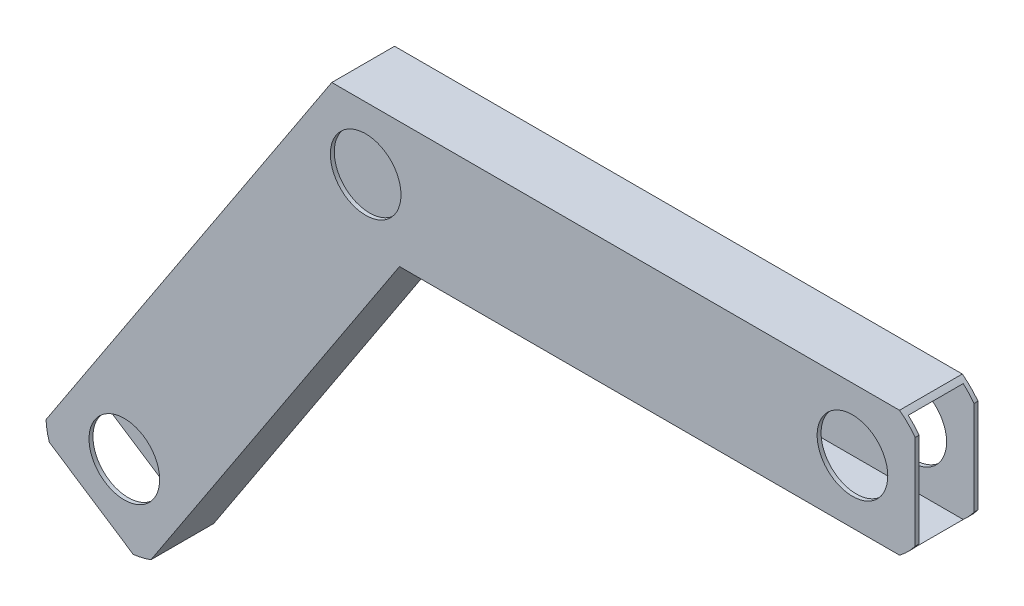
ISO-10303-21;
HEADER;
FILE_DESCRIPTION(('STEP AP214'),'2;1');
FILE_NAME('part.step','',(''),(''),'','','');
FILE_SCHEMA(('AUTOMOTIVE_DESIGN { 1 0 10303 214 1 1 1 1 }'));
ENDSEC;
DATA;
#1=APPLICATION_CONTEXT('core data for automotive mechanical design processes');
#2=APPLICATION_PROTOCOL_DEFINITION('international standard','automotive_design',2000,#1);
#3=PRODUCT_CONTEXT('',#1,'mechanical');
#4=PRODUCT('Part','Part','',(#3));
#5=PRODUCT_RELATED_PRODUCT_CATEGORY('part','',(#4));
#6=PRODUCT_DEFINITION_FORMATION('','',#4);
#7=PRODUCT_DEFINITION_CONTEXT('part definition',#1,'design');
#8=PRODUCT_DEFINITION('design','',#6,#7);
#9=PRODUCT_DEFINITION_SHAPE('','',#8);
#10=(LENGTH_UNIT() NAMED_UNIT(*) SI_UNIT(.MILLI.,.METRE.));
#11=(NAMED_UNIT(*) PLANE_ANGLE_UNIT() SI_UNIT($,.RADIAN.));
#12=(NAMED_UNIT(*) SI_UNIT($,.STERADIAN.) SOLID_ANGLE_UNIT());
#13=UNCERTAINTY_MEASURE_WITH_UNIT(LENGTH_MEASURE(1.E-05),#10,'distance_accuracy_value','');
#14=(GEOMETRIC_REPRESENTATION_CONTEXT(3) GLOBAL_UNCERTAINTY_ASSIGNED_CONTEXT((#13)) GLOBAL_UNIT_ASSIGNED_CONTEXT((#10,
#11,#12)) REPRESENTATION_CONTEXT('',''));
#15=CARTESIAN_POINT('',(0.,0.,0.));
#16=DIRECTION('',(0.,0.,1.));
#17=DIRECTION('',(1.,0.,0.));
#18=AXIS2_PLACEMENT_3D('',#15,#16,#17);
#19=CARTESIAN_POINT('',(117.084839529221,0.,25.4));
#20=DIRECTION('',(1.,0.,0.));
#21=DIRECTION('',(0.,0.,-1.));
#22=AXIS2_PLACEMENT_3D('',#19,#20,#21);
#23=PLANE('',#22);
#24=DIRECTION('',(0.,-1.,0.));
#25=VECTOR('',#24,1.);
#26=CARTESIAN_POINT('',(117.084839529221,0.,0.));
#27=LINE('',#26,#25);
#28=CARTESIAN_POINT('',(117.084839529221,81.4930210598951,0.));
#29=VERTEX_POINT('',#28);
#30=CARTESIAN_POINT('',(117.084839529221,43.3930210598951,0.));
#31=VERTEX_POINT('',#30);
#32=EDGE_CURVE('E248',#29,#31,#27,.T.);
#33=ORIENTED_EDGE('',*,*,#32,.F.);
#34=DIRECTION('',(0.,0.,1.));
#35=VECTOR('',#34,1.);
#36=CARTESIAN_POINT('',(117.084839529221,81.4930210598951,0.));
#37=LINE('',#36,#35);
#38=CARTESIAN_POINT('',(117.084839529221,81.4930210598951,1.5875));
#39=VERTEX_POINT('',#38);
#40=EDGE_CURVE('E230',#29,#39,#37,.T.);
#41=ORIENTED_EDGE('',*,*,#40,.T.);
#42=DIRECTION('',(0.,-1.,0.));
#43=VECTOR('',#42,1.);
#44=CARTESIAN_POINT('',(117.084839529221,0.,1.5875));
#45=LINE('',#44,#43);
#46=CARTESIAN_POINT('',(117.084839529221,43.3930210598951,1.5875));
#47=VERTEX_POINT('',#46);
#48=EDGE_CURVE('E320',#39,#47,#45,.T.);
#49=ORIENTED_EDGE('',*,*,#48,.T.);
#50=DIRECTION('',(0.,0.,1.));
#51=VECTOR('',#50,1.);
#52=CARTESIAN_POINT('',(117.084839529221,43.3930210598951,0.));
#53=LINE('',#52,#51);
#54=EDGE_CURVE('E254',#31,#47,#53,.T.);
#55=ORIENTED_EDGE('',*,*,#54,.F.);
#56=EDGE_LOOP('',(#33,#41,#49,#55));
#57=FACE_BOUND('',#56,.T.);
#58=ADVANCED_FACE('F96',(#57),#23,.T.);
#59=DIRECTION('',(0.,-1.,0.));
#60=VECTOR('',#59,1.);
#61=CARTESIAN_POINT('',(117.084839529221,0.,23.8125));
#62=LINE('',#61,#60);
#63=CARTESIAN_POINT('',(117.084839529221,81.4930210598951,23.8125));
#64=VERTEX_POINT('',#63);
#65=CARTESIAN_POINT('',(117.084839529221,43.3930210598951,23.8125));
#66=VERTEX_POINT('',#65);
#67=EDGE_CURVE('E305',#64,#66,#62,.T.);
#68=ORIENTED_EDGE('',*,*,#67,.F.);
#69=CARTESIAN_POINT('',(117.084839529221,81.4930210598951,25.4));
#70=VERTEX_POINT('',#69);
#71=EDGE_CURVE('E110',#64,#70,#37,.T.);
#72=ORIENTED_EDGE('',*,*,#71,.T.);
#73=DIRECTION('',(0.,-1.,0.));
#74=VECTOR('',#73,1.);
#75=CARTESIAN_POINT('',(117.084839529221,0.,25.4));
#76=LINE('',#75,#74);
#77=CARTESIAN_POINT('',(117.084839529221,43.3930210598951,25.4));
#78=VERTEX_POINT('',#77);
#79=EDGE_CURVE('E270',#70,#78,#76,.T.);
#80=ORIENTED_EDGE('',*,*,#79,.T.);
#81=EDGE_CURVE('E293',#66,#78,#53,.T.);
#82=ORIENTED_EDGE('',*,*,#81,.F.);
#83=EDGE_LOOP('',(#68,#72,#80,#82));
#84=FACE_BOUND('',#83,.T.);
#85=ADVANCED_FACE('F304',(#84),#23,.T.);
#86=CARTESIAN_POINT('',(-123.41152045591,81.10855245846,25.4));
#87=DIRECTION('',(-0.835675789047102,0.549223065430162,0.));
#88=DIRECTION('',(-0.549223065430162,-0.835675789047102,0.));
#89=AXIS2_PLACEMENT_3D('',#86,#87,#88);
#90=PLANE('',#89);
#91=DIRECTION('',(0.549223065430162,0.835675789047102,0.));
#92=VECTOR('',#91,1.);
#93=CARTESIAN_POINT('',(-123.41152045591,81.10855245846,0.));
#94=LINE('',#93,#92);
#95=CARTESIAN_POINT('',(-234.625048962084,-88.1094921521008,0.));
#96=VERTEX_POINT('',#95);
#97=CARTESIAN_POINT('',(-118.98549120174,87.8430210598951,0.));
#98=VERTEX_POINT('',#97);
#99=EDGE_CURVE('E334',#96,#98,#94,.T.);
#100=ORIENTED_EDGE('',*,*,#99,.F.);
#101=DIRECTION('',(0.,0.,1.));
#102=VECTOR('',#101,1.);
#103=CARTESIAN_POINT('',(-234.625048962084,-88.1094921521008,0.));
#104=LINE('',#103,#102);
#105=CARTESIAN_POINT('',(-234.625048962084,-88.1094921521008,25.4));
#106=VERTEX_POINT('',#105);
#107=EDGE_CURVE('E361',#96,#106,#104,.T.);
#108=ORIENTED_EDGE('',*,*,#107,.T.);
#109=DIRECTION('',(0.549223065430162,0.835675789047102,0.));
#110=VECTOR('',#109,1.);
#111=CARTESIAN_POINT('',(-123.41152045591,81.10855245846,25.4));
#112=LINE('',#111,#110);
#113=CARTESIAN_POINT('',(-118.98549120174,87.8430210598951,25.4));
#114=VERTEX_POINT('',#113);
#115=EDGE_CURVE('E259',#106,#114,#112,.T.);
#116=ORIENTED_EDGE('',*,*,#115,.T.);
#117=DIRECTION('',(0.,0.,-1.));
#118=VECTOR('',#117,1.);
#119=CARTESIAN_POINT('',(-118.98549120174,87.8430210598951,25.4));
#120=LINE('',#119,#118);
#121=EDGE_CURVE('E269',#114,#98,#120,.T.);
#122=ORIENTED_EDGE('',*,*,#121,.T.);
#123=EDGE_LOOP('',(#100,#108,#116,#122));
#124=FACE_BOUND('',#123,.T.);
#125=ADVANCED_FACE('F465',(#124),#90,.T.);
#126=CARTESIAN_POINT('',(-114.151230572203,-173.687934253834,25.4));
#127=DIRECTION('',(-0.549223065430162,-0.835675789047102,0.));
#128=DIRECTION('',(0.835675789047102,-0.549223065430162,0.));
#129=AXIS2_PLACEMENT_3D('',#126,#127,#128);
#130=PLANE('',#129);
#131=DIRECTION('',(-0.835675789047102,0.549223065430162,0.));
#132=VECTOR('',#131,1.);
#133=CARTESIAN_POINT('',(-114.151230572203,-173.687934253834,25.4));
#134=LINE('',#133,#132);
#135=CARTESIAN_POINT('',(-199.358592994551,-117.687928749088,25.4));
#136=VERTEX_POINT('',#135);
#137=CARTESIAN_POINT('',(-233.314578978081,-95.3713665655125,25.4));
#138=VERTEX_POINT('',#137);
#139=EDGE_CURVE('E324',#136,#138,#134,.T.);
#140=ORIENTED_EDGE('',*,*,#139,.T.);
#141=DIRECTION('',(0.,0.,1.));
#142=VECTOR('',#141,1.);
#143=CARTESIAN_POINT('',(-233.314578978081,-95.3713665655125,0.));
#144=LINE('',#143,#142);
#145=CARTESIAN_POINT('',(-233.314578978081,-95.3713665655125,23.8125));
#146=VERTEX_POINT('',#145);
#147=EDGE_CURVE('E366',#146,#138,#144,.T.);
#148=ORIENTED_EDGE('',*,*,#147,.F.);
#149=DIRECTION('',(-0.835675789047102,0.549223065430162,0.));
#150=VECTOR('',#149,1.);
#151=CARTESIAN_POINT('',(-196.437056259632,-119.608021902856,23.8125));
#152=LINE('',#151,#150);
#153=CARTESIAN_POINT('',(-199.358592994551,-117.687928749088,23.8125));
#154=VERTEX_POINT('',#153);
#155=EDGE_CURVE('E419',#154,#146,#152,.T.);
#156=ORIENTED_EDGE('',*,*,#155,.F.);
#157=DIRECTION('',(0.,0.,1.));
#158=VECTOR('',#157,1.);
#159=CARTESIAN_POINT('',(-199.358592994551,-117.687928749088,0.));
#160=LINE('',#159,#158);
#161=EDGE_CURVE('E371',#154,#136,#160,.T.);
#162=ORIENTED_EDGE('',*,*,#161,.T.);
#163=EDGE_LOOP('',(#140,#148,#156,#162));
#164=FACE_BOUND('',#163,.T.);
#165=ADVANCED_FACE('F477',(#164),#130,.T.);
#166=DIRECTION('',(0.835675789047102,-0.549223065430162,0.));
#167=VECTOR('',#166,1.);
#168=CARTESIAN_POINT('',(-196.437056259632,-119.608021902856,1.5875));
#169=LINE('',#168,#167);
#170=CARTESIAN_POINT('',(-233.314578978081,-95.3713665655125,1.5875));
#171=VERTEX_POINT('',#170);
#172=CARTESIAN_POINT('',(-199.358592994551,-117.687928749088,1.5875));
#173=VERTEX_POINT('',#172);
#174=EDGE_CURVE('E422',#171,#173,#169,.T.);
#175=ORIENTED_EDGE('',*,*,#174,.F.);
#176=CARTESIAN_POINT('',(-233.314578978081,-95.3713665655125,0.));
#177=VERTEX_POINT('',#176);
#178=EDGE_CURVE('E355',#177,#171,#144,.T.);
#179=ORIENTED_EDGE('',*,*,#178,.F.);
#180=DIRECTION('',(-0.835675789047102,0.549223065430162,0.));
#181=VECTOR('',#180,1.);
#182=CARTESIAN_POINT('',(-114.151230572203,-173.687934253834,0.));
#183=LINE('',#182,#181);
#184=CARTESIAN_POINT('',(-199.358592994551,-117.687928749088,0.));
#185=VERTEX_POINT('',#184);
#186=EDGE_CURVE('E336',#185,#177,#183,.T.);
#187=ORIENTED_EDGE('',*,*,#186,.F.);
#188=EDGE_CURVE('E376',#185,#173,#160,.T.);
#189=ORIENTED_EDGE('',*,*,#188,.T.);
#190=EDGE_LOOP('',(#175,#179,#187,#189));
#191=FACE_BOUND('',#190,.T.);
#192=ADVANCED_FACE('F460',(#191),#130,.T.);
#193=CARTESIAN_POINT('',(-80.9591903723169,53.2080207346078,25.4));
#194=DIRECTION('',(-0.835675789047102,0.549223065430162,0.));
#195=DIRECTION('',(-0.549223065430162,-0.835675789047102,0.));
#196=AXIS2_PLACEMENT_3D('',#193,#194,#195);
#197=PLANE('',#196);
#198=DIRECTION('',(0.,0.,1.));
#199=VECTOR('',#198,1.);
#200=CARTESIAN_POINT('',(-192.172718878492,-116.010023875953,0.));
#201=LINE('',#200,#199);
#202=CARTESIAN_POINT('',(-192.172718878492,-116.010023875953,0.));
#203=VERTEX_POINT('',#202);
#204=CARTESIAN_POINT('',(-192.172718878492,-116.010023875953,25.4));
#205=VERTEX_POINT('',#204);
#206=EDGE_CURVE('E345',#203,#205,#201,.T.);
#207=ORIENTED_EDGE('',*,*,#206,.F.);
#208=DIRECTION('',(0.549223065430162,0.835675789047102,0.));
#209=VECTOR('',#208,1.);
#210=CARTESIAN_POINT('',(-80.9591903723169,53.2080207346078,0.));
#211=LINE('',#210,#209);
#212=CARTESIAN_POINT('',(-91.5831557789811,37.0430210598951,0.));
#213=VERTEX_POINT('',#212);
#214=EDGE_CURVE('E262',#203,#213,#211,.T.);
#215=ORIENTED_EDGE('',*,*,#214,.T.);
#216=DIRECTION('',(0.,0.,-1.));
#217=VECTOR('',#216,1.);
#218=CARTESIAN_POINT('',(-91.5831557789811,37.0430210598951,25.4));
#219=LINE('',#218,#217);
#220=CARTESIAN_POINT('',(-91.5831557789811,37.0430210598951,25.4));
#221=VERTEX_POINT('',#220);
#222=EDGE_CURVE('E266',#221,#213,#219,.T.);
#223=ORIENTED_EDGE('',*,*,#222,.F.);
#224=DIRECTION('',(0.549223065430162,0.835675789047102,0.));
#225=VECTOR('',#224,1.);
#226=CARTESIAN_POINT('',(-80.9591903723169,53.2080207346078,25.4));
#227=LINE('',#226,#225);
#228=EDGE_CURVE('E327',#205,#221,#227,.T.);
#229=ORIENTED_EDGE('',*,*,#228,.F.);
#230=EDGE_LOOP('',(#207,#215,#223,#229));
#231=FACE_BOUND('',#230,.T.);
#232=ADVANCED_FACE('F342',(#231),#197,.F.);
#233=CARTESIAN_POINT('',(0.,37.0430210598951,25.4));
#234=DIRECTION('',(0.,1.,0.));
#235=DIRECTION('',(-1.,0.,0.));
#236=AXIS2_PLACEMENT_3D('',#233,#234,#235);
#237=PLANE('',#236);
#238=DIRECTION('',(0.,0.,1.));
#239=VECTOR('',#238,1.);
#240=CARTESIAN_POINT('',(110.734839529221,37.0430210598951,0.));
#241=LINE('',#240,#239);
#242=CARTESIAN_POINT('',(110.734839529221,37.0430210598951,0.));
#243=VERTEX_POINT('',#242);
#244=CARTESIAN_POINT('',(110.734839529221,37.0430210598951,25.4));
#245=VERTEX_POINT('',#244);
#246=EDGE_CURVE('E307',#243,#245,#241,.T.);
#247=ORIENTED_EDGE('',*,*,#246,.T.);
#248=DIRECTION('',(1.,0.,0.));
#249=VECTOR('',#248,1.);
#250=CARTESIAN_POINT('',(0.,37.0430210598951,25.4));
#251=LINE('',#250,#249);
#252=EDGE_CURVE('E329',#221,#245,#251,.T.);
#253=ORIENTED_EDGE('',*,*,#252,.F.);
#254=ORIENTED_EDGE('',*,*,#222,.T.);
#255=DIRECTION('',(1.,0.,0.));
#256=VECTOR('',#255,1.);
#257=CARTESIAN_POINT('',(0.,37.0430210598951,0.));
#258=LINE('',#257,#256);
#259=EDGE_CURVE('E256',#213,#243,#258,.T.);
#260=ORIENTED_EDGE('',*,*,#259,.T.);
#261=EDGE_LOOP('',(#247,#253,#254,#260));
#262=FACE_BOUND('',#261,.T.);
#263=ADVANCED_FACE('F350',(#262),#237,.F.);
#264=CARTESIAN_POINT('',(0.,87.8430210598951,25.4));
#265=DIRECTION('',(0.,1.,0.));
#266=DIRECTION('',(-1.,0.,0.));
#267=AXIS2_PLACEMENT_3D('',#264,#265,#266);
#268=PLANE('',#267);
#269=DIRECTION('',(1.,0.,0.));
#270=VECTOR('',#269,1.);
#271=CARTESIAN_POINT('',(0.,87.8430210598951,25.4));
#272=LINE('',#271,#270);
#273=CARTESIAN_POINT('',(110.734839529221,87.8430210598951,25.4));
#274=VERTEX_POINT('',#273);
#275=EDGE_CURVE('E255',#114,#274,#272,.T.);
#276=ORIENTED_EDGE('',*,*,#275,.T.);
#277=DIRECTION('',(0.,0.,1.));
#278=VECTOR('',#277,1.);
#279=CARTESIAN_POINT('',(110.734839529221,87.8430210598951,0.));
#280=LINE('',#279,#278);
#281=CARTESIAN_POINT('',(110.734839529221,87.8430210598951,0.));
#282=VERTEX_POINT('',#281);
#283=EDGE_CURVE('E241',#282,#274,#280,.T.);
#284=ORIENTED_EDGE('',*,*,#283,.F.);
#285=DIRECTION('',(1.,0.,0.));
#286=VECTOR('',#285,1.);
#287=CARTESIAN_POINT('',(0.,87.8430210598951,0.));
#288=LINE('',#287,#286);
#289=EDGE_CURVE('E250',#98,#282,#288,.T.);
#290=ORIENTED_EDGE('',*,*,#289,.F.);
#291=ORIENTED_EDGE('',*,*,#121,.F.);
#292=EDGE_LOOP('',(#276,#284,#290,#291));
#293=FACE_BOUND('',#292,.T.);
#294=ADVANCED_FACE('F98',(#293),#268,.T.);
#295=CARTESIAN_POINT('',(0.,0.,0.));
#296=DIRECTION('',(0.,0.,1.));
#297=DIRECTION('',(1.,0.,0.));
#298=AXIS2_PLACEMENT_3D('',#295,#296,#297);
#299=PLANE('',#298);
#300=CARTESIAN_POINT('',(-202.936184523844,-86.1401342326796,0.));
#301=DIRECTION('',(0.,0.,1.));
#302=DIRECTION('',(1.,0.,0.));
#303=AXIS2_PLACEMENT_3D('',#300,#301,#302);
#304=CIRCLE('',#303,14.2875);
#305=CARTESIAN_POINT('',(-188.648684523844,-86.1401342326796,0.));
#306=VERTEX_POINT('',#305);
#307=EDGE_CURVE('E399',#306,#306,#304,.T.);
#308=ORIENTED_EDGE('',*,*,#307,.T.);
#309=EDGE_LOOP('',(#308));
#310=FACE_BOUND('',#309,.T.);
#311=CARTESIAN_POINT('',(91.6848395292212,62.4430210598951,0.));
#312=DIRECTION('',(0.,0.,1.));
#313=DIRECTION('',(1.,0.,0.));
#314=AXIS2_PLACEMENT_3D('',#311,#312,#313);
#315=CIRCLE('',#314,14.2875);
#316=CARTESIAN_POINT('',(105.972339529221,62.4430210598951,0.));
#317=VERTEX_POINT('',#316);
#318=EDGE_CURVE('E405',#317,#317,#315,.T.);
#319=ORIENTED_EDGE('',*,*,#318,.T.);
#320=EDGE_LOOP('',(#319));
#321=FACE_BOUND('',#320,.T.);
#322=CARTESIAN_POINT('',(-105.284323490361,62.4430210598951,0.));
#323=DIRECTION('',(0.,0.,1.));
#324=DIRECTION('',(1.,0.,0.));
#325=AXIS2_PLACEMENT_3D('',#322,#323,#324);
#326=CIRCLE('',#325,14.2875);
#327=CARTESIAN_POINT('',(-90.9968234903607,62.4430210598951,0.));
#328=VERTEX_POINT('',#327);
#329=EDGE_CURVE('E396',#328,#328,#326,.T.);
#330=ORIENTED_EDGE('',*,*,#329,.T.);
#331=EDGE_LOOP('',(#330));
#332=FACE_BOUND('',#331,.T.);
#333=CARTESIAN_POINT('',(91.6848395292212,62.4430210598951,0.));
#334=DIRECTION('',(0.,0.,1.));
#335=DIRECTION('',(1.,0.,0.));
#336=AXIS2_PLACEMENT_3D('',#333,#334,#335);
#337=CIRCLE('',#336,31.75);
#338=EDGE_CURVE('E233',#29,#282,#337,.T.);
#339=ORIENTED_EDGE('',*,*,#338,.F.);
#340=ORIENTED_EDGE('',*,*,#32,.T.);
#341=CARTESIAN_POINT('',(91.6848395292212,62.4430210598951,0.));
#342=DIRECTION('',(0.,0.,1.));
#343=DIRECTION('',(1.,0.,0.));
#344=AXIS2_PLACEMENT_3D('',#341,#342,#343);
#345=CIRCLE('',#344,31.75);
#346=EDGE_CURVE('E351',#243,#31,#345,.T.);
#347=ORIENTED_EDGE('',*,*,#346,.F.);
#348=ORIENTED_EDGE('',*,*,#259,.F.);
#349=ORIENTED_EDGE('',*,*,#214,.F.);
#350=CARTESIAN_POINT('',(-202.936184523844,-86.1401342326796,0.));
#351=DIRECTION('',(0.,0.,1.));
#352=DIRECTION('',(1.,0.,0.));
#353=AXIS2_PLACEMENT_3D('',#350,#351,#352);
#354=CIRCLE('',#353,31.75);
#355=EDGE_CURVE('E369',#185,#203,#354,.T.);
#356=ORIENTED_EDGE('',*,*,#355,.F.);
#357=ORIENTED_EDGE('',*,*,#186,.T.);
#358=CARTESIAN_POINT('',(-202.936184523844,-86.1401342326796,0.));
#359=DIRECTION('',(0.,0.,1.));
#360=DIRECTION('',(1.,0.,0.));
#361=AXIS2_PLACEMENT_3D('',#358,#359,#360);
#362=CIRCLE('',#361,31.75);
#363=EDGE_CURVE('E359',#96,#177,#362,.T.);
#364=ORIENTED_EDGE('',*,*,#363,.F.);
#365=ORIENTED_EDGE('',*,*,#99,.T.);
#366=ORIENTED_EDGE('',*,*,#289,.T.);
#367=EDGE_LOOP('',(#339,#340,#347,#348,#349,#356,#357,#364,#365,#366));
#368=FACE_BOUND('',#367,.T.);
#369=ADVANCED_FACE('F246',(#310,#321,#332,#368),#299,.F.);
#370=CARTESIAN_POINT('',(0.,0.,25.4));
#371=DIRECTION('',(0.,0.,1.));
#372=DIRECTION('',(1.,0.,0.));
#373=AXIS2_PLACEMENT_3D('',#370,#371,#372);
#374=PLANE('',#373);
#375=CARTESIAN_POINT('',(-202.936184523844,-86.1401342326796,25.4));
#376=DIRECTION('',(0.,0.,1.));
#377=DIRECTION('',(1.,0.,0.));
#378=AXIS2_PLACEMENT_3D('',#375,#376,#377);
#379=CIRCLE('',#378,14.2875);
#380=CARTESIAN_POINT('',(-188.648684523844,-86.1401342326796,25.4));
#381=VERTEX_POINT('',#380);
#382=EDGE_CURVE('E278',#381,#381,#379,.T.);
#383=ORIENTED_EDGE('',*,*,#382,.F.);
#384=EDGE_LOOP('',(#383));
#385=FACE_BOUND('',#384,.T.);
#386=CARTESIAN_POINT('',(91.6848395292212,62.4430210598951,25.4));
#387=DIRECTION('',(0.,0.,1.));
#388=DIRECTION('',(1.,0.,0.));
#389=AXIS2_PLACEMENT_3D('',#386,#387,#388);
#390=CIRCLE('',#389,14.2875);
#391=CARTESIAN_POINT('',(105.972339529221,62.4430210598951,25.4));
#392=VERTEX_POINT('',#391);
#393=EDGE_CURVE('E402',#392,#392,#390,.T.);
#394=ORIENTED_EDGE('',*,*,#393,.F.);
#395=EDGE_LOOP('',(#394));
#396=FACE_BOUND('',#395,.T.);
#397=CARTESIAN_POINT('',(-105.284323490361,62.4430210598951,25.4));
#398=DIRECTION('',(0.,0.,1.));
#399=DIRECTION('',(1.,0.,0.));
#400=AXIS2_PLACEMENT_3D('',#397,#398,#399);
#401=CIRCLE('',#400,14.2875);
#402=CARTESIAN_POINT('',(-90.9968234903607,62.4430210598951,25.4));
#403=VERTEX_POINT('',#402);
#404=EDGE_CURVE('E408',#403,#403,#401,.T.);
#405=ORIENTED_EDGE('',*,*,#404,.F.);
#406=EDGE_LOOP('',(#405));
#407=FACE_BOUND('',#406,.T.);
#408=ORIENTED_EDGE('',*,*,#79,.F.);
#409=CARTESIAN_POINT('',(91.6848395292212,62.4430210598951,25.4));
#410=DIRECTION('',(0.,0.,1.));
#411=DIRECTION('',(1.,0.,0.));
#412=AXIS2_PLACEMENT_3D('',#409,#410,#411);
#413=CIRCLE('',#412,31.75);
#414=EDGE_CURVE('E251',#70,#274,#413,.T.);
#415=ORIENTED_EDGE('',*,*,#414,.T.);
#416=ORIENTED_EDGE('',*,*,#275,.F.);
#417=ORIENTED_EDGE('',*,*,#115,.F.);
#418=CARTESIAN_POINT('',(-202.936184523844,-86.1401342326796,25.4));
#419=DIRECTION('',(0.,0.,1.));
#420=DIRECTION('',(1.,0.,0.));
#421=AXIS2_PLACEMENT_3D('',#418,#419,#420);
#422=CIRCLE('',#421,31.75);
#423=EDGE_CURVE('E362',#106,#138,#422,.T.);
#424=ORIENTED_EDGE('',*,*,#423,.T.);
#425=ORIENTED_EDGE('',*,*,#139,.F.);
#426=CARTESIAN_POINT('',(-202.936184523844,-86.1401342326796,25.4));
#427=DIRECTION('',(0.,0.,1.));
#428=DIRECTION('',(1.,0.,0.));
#429=AXIS2_PLACEMENT_3D('',#426,#427,#428);
#430=CIRCLE('',#429,31.75);
#431=EDGE_CURVE('E372',#136,#205,#430,.T.);
#432=ORIENTED_EDGE('',*,*,#431,.T.);
#433=ORIENTED_EDGE('',*,*,#228,.T.);
#434=ORIENTED_EDGE('',*,*,#252,.T.);
#435=CARTESIAN_POINT('',(91.6848395292212,62.4430210598951,25.4));
#436=DIRECTION('',(0.,0.,1.));
#437=DIRECTION('',(1.,0.,0.));
#438=AXIS2_PLACEMENT_3D('',#435,#436,#437);
#439=CIRCLE('',#438,31.75);
#440=EDGE_CURVE('E352',#245,#78,#439,.T.);
#441=ORIENTED_EDGE('',*,*,#440,.T.);
#442=EDGE_LOOP('',(#408,#415,#416,#417,#424,#425,#432,#433,#434,#441));
#443=FACE_BOUND('',#442,.T.);
#444=ADVANCED_FACE('F473',(#385,#396,#407,#443),#374,.T.);
#445=CARTESIAN_POINT('',(-122.084885140797,80.2366608420896,25.4));
#446=DIRECTION('',(-0.835675789047102,0.549223065430162,0.));
#447=DIRECTION('',(-0.549223065430162,-0.835675789047102,0.));
#448=AXIS2_PLACEMENT_3D('',#445,#446,#447);
#449=PLANE('',#448);
#450=DIRECTION('',(0.,0.,1.));
#451=VECTOR('',#450,1.);
#452=CARTESIAN_POINT('',(-234.369756186118,-90.6114956084383,0.));
#453=LINE('',#452,#451);
#454=CARTESIAN_POINT('',(-234.369756186118,-90.6114956084383,1.5875));
#455=VERTEX_POINT('',#454);
#456=CARTESIAN_POINT('',(-234.369756186118,-90.6114956084383,23.8125));
#457=VERTEX_POINT('',#456);
#458=EDGE_CURVE('E118',#455,#457,#453,.T.);
#459=ORIENTED_EDGE('',*,*,#458,.F.);
#460=DIRECTION('',(0.549223065430162,0.835675789047102,0.));
#461=VECTOR('',#460,1.);
#462=CARTESIAN_POINT('',(-122.084885140797,80.2366608420896,1.5875));
#463=LINE('',#462,#461);
#464=CARTESIAN_POINT('',(-118.129168219779,86.2555210598951,1.5875));
#465=VERTEX_POINT('',#464);
#466=EDGE_CURVE('E426',#455,#465,#463,.T.);
#467=ORIENTED_EDGE('',*,*,#466,.T.);
#468=DIRECTION('',(0.,0.,-1.));
#469=VECTOR('',#468,1.);
#470=CARTESIAN_POINT('',(-118.129168219779,86.2555210598951,25.4));
#471=LINE('',#470,#469);
#472=CARTESIAN_POINT('',(-118.129168219779,86.2555210598951,23.8125));
#473=VERTEX_POINT('',#472);
#474=EDGE_CURVE('E315',#473,#465,#471,.T.);
#475=ORIENTED_EDGE('',*,*,#474,.F.);
#476=DIRECTION('',(0.549223065430162,0.835675789047102,0.));
#477=VECTOR('',#476,1.);
#478=CARTESIAN_POINT('',(-122.084885140797,80.2366608420896,23.8125));
#479=LINE('',#478,#477);
#480=EDGE_CURVE('E429',#457,#473,#479,.T.);
#481=ORIENTED_EDGE('',*,*,#480,.F.);
#482=EDGE_LOOP('',(#459,#467,#475,#481));
#483=FACE_BOUND('',#482,.T.);
#484=ADVANCED_FACE('F482',(#483),#449,.F.);
#485=CARTESIAN_POINT('',(-82.2858256874292,54.0799123509782,25.4));
#486=DIRECTION('',(-0.835675789047102,0.549223065430162,0.));
#487=DIRECTION('',(-0.549223065430162,-0.835675789047102,0.));
#488=AXIS2_PLACEMENT_3D('',#485,#486,#487);
#489=PLANE('',#488);
#490=DIRECTION('',(0.549223065430162,0.835675789047102,0.));
#491=VECTOR('',#490,1.);
#492=CARTESIAN_POINT('',(-82.2858256874292,54.0799123509782,1.5875));
#493=LINE('',#492,#491);
#494=CARTESIAN_POINT('',(-194.57069673275,-116.76824409955,1.5875));
#495=VERTEX_POINT('',#494);
#496=CARTESIAN_POINT('',(-92.4394787609424,38.6305210598951,1.5875));
#497=VERTEX_POINT('',#496);
#498=EDGE_CURVE('E428',#495,#497,#493,.T.);
#499=ORIENTED_EDGE('',*,*,#498,.F.);
#500=DIRECTION('',(0.,0.,1.));
#501=VECTOR('',#500,1.);
#502=CARTESIAN_POINT('',(-194.57069673275,-116.76824409955,0.));
#503=LINE('',#502,#501);
#504=CARTESIAN_POINT('',(-194.57069673275,-116.76824409955,23.8125));
#505=VERTEX_POINT('',#504);
#506=EDGE_CURVE('E379',#495,#505,#503,.T.);
#507=ORIENTED_EDGE('',*,*,#506,.T.);
#508=DIRECTION('',(0.549223065430162,0.835675789047102,0.));
#509=VECTOR('',#508,1.);
#510=CARTESIAN_POINT('',(-82.2858256874292,54.0799123509782,23.8125));
#511=LINE('',#510,#509);
#512=CARTESIAN_POINT('',(-92.4394787609424,38.6305210598951,23.8125));
#513=VERTEX_POINT('',#512);
#514=EDGE_CURVE('E317',#505,#513,#511,.T.);
#515=ORIENTED_EDGE('',*,*,#514,.T.);
#516=DIRECTION('',(0.,0.,-1.));
#517=VECTOR('',#516,1.);
#518=CARTESIAN_POINT('',(-92.4394787609424,38.6305210598951,25.4));
#519=LINE('',#518,#517);
#520=EDGE_CURVE('E311',#513,#497,#519,.T.);
#521=ORIENTED_EDGE('',*,*,#520,.T.);
#522=EDGE_LOOP('',(#499,#507,#515,#521));
#523=FACE_BOUND('',#522,.T.);
#524=ADVANCED_FACE('F453',(#523),#489,.T.);
#525=CARTESIAN_POINT('',(0.,38.6305210598951,25.4));
#526=DIRECTION('',(0.,1.,0.));
#527=DIRECTION('',(-1.,0.,0.));
#528=AXIS2_PLACEMENT_3D('',#525,#526,#527);
#529=PLANE('',#528);
#530=DIRECTION('',(1.,0.,0.));
#531=VECTOR('',#530,1.);
#532=CARTESIAN_POINT('',(0.,38.6305210598951,23.8125));
#533=LINE('',#532,#531);
#534=CARTESIAN_POINT('',(112.685490560796,38.6305210598951,23.8125));
#535=VERTEX_POINT('',#534);
#536=EDGE_CURVE('E312',#513,#535,#533,.T.);
#537=ORIENTED_EDGE('',*,*,#536,.T.);
#538=DIRECTION('',(0.,0.,1.));
#539=VECTOR('',#538,1.);
#540=CARTESIAN_POINT('',(112.685490560796,38.6305210598951,0.));
#541=LINE('',#540,#539);
#542=CARTESIAN_POINT('',(112.685490560796,38.6305210598951,1.5875));
#543=VERTEX_POINT('',#542);
#544=EDGE_CURVE('E296',#535,#543,#541,.F.);
#545=ORIENTED_EDGE('',*,*,#544,.T.);
#546=DIRECTION('',(1.,0.,0.));
#547=VECTOR('',#546,1.);
#548=CARTESIAN_POINT('',(0.,38.6305210598951,1.5875));
#549=LINE('',#548,#547);
#550=EDGE_CURVE('E434',#497,#543,#549,.T.);
#551=ORIENTED_EDGE('',*,*,#550,.F.);
#552=ORIENTED_EDGE('',*,*,#520,.F.);
#553=EDGE_LOOP('',(#537,#545,#551,#552));
#554=FACE_BOUND('',#553,.T.);
#555=ADVANCED_FACE('F446',(#554),#529,.T.);
#556=CARTESIAN_POINT('',(0.,86.2555210598951,25.4));
#557=DIRECTION('',(0.,1.,0.));
#558=DIRECTION('',(-1.,0.,0.));
#559=AXIS2_PLACEMENT_3D('',#556,#557,#558);
#560=PLANE('',#559);
#561=DIRECTION('',(0.,0.,1.));
#562=VECTOR('',#561,1.);
#563=CARTESIAN_POINT('',(112.685490560796,86.2555210598951,0.));
#564=LINE('',#563,#562);
#565=CARTESIAN_POINT('',(112.685490560796,86.2555210598951,23.8125));
#566=VERTEX_POINT('',#565);
#567=CARTESIAN_POINT('',(112.685490560796,86.2555210598951,1.5875));
#568=VERTEX_POINT('',#567);
#569=EDGE_CURVE('E393',#566,#568,#564,.F.);
#570=ORIENTED_EDGE('',*,*,#569,.F.);
#571=DIRECTION('',(1.,0.,0.));
#572=VECTOR('',#571,1.);
#573=CARTESIAN_POINT('',(0.,86.2555210598951,23.8125));
#574=LINE('',#573,#572);
#575=EDGE_CURVE('E431',#473,#566,#574,.T.);
#576=ORIENTED_EDGE('',*,*,#575,.F.);
#577=ORIENTED_EDGE('',*,*,#474,.T.);
#578=DIRECTION('',(1.,0.,0.));
#579=VECTOR('',#578,1.);
#580=CARTESIAN_POINT('',(0.,86.2555210598951,1.5875));
#581=LINE('',#580,#579);
#582=EDGE_CURVE('E425',#465,#568,#581,.T.);
#583=ORIENTED_EDGE('',*,*,#582,.T.);
#584=EDGE_LOOP('',(#570,#576,#577,#583));
#585=FACE_BOUND('',#584,.T.);
#586=ADVANCED_FACE('F485',(#585),#560,.F.);
#587=CARTESIAN_POINT('',(0.,0.,1.5875));
#588=DIRECTION('',(0.,0.,1.));
#589=DIRECTION('',(1.,0.,0.));
#590=AXIS2_PLACEMENT_3D('',#587,#588,#589);
#591=PLANE('',#590);
#592=CARTESIAN_POINT('',(-202.936184523844,-86.1401342326796,1.5875));
#593=DIRECTION('',(0.,0.,1.));
#594=DIRECTION('',(1.,0.,0.));
#595=AXIS2_PLACEMENT_3D('',#592,#593,#594);
#596=CIRCLE('',#595,14.2875);
#597=CARTESIAN_POINT('',(-188.648684523844,-86.1401342326796,1.5875));
#598=VERTEX_POINT('',#597);
#599=EDGE_CURVE('E286',#598,#598,#596,.F.);
#600=ORIENTED_EDGE('',*,*,#599,.T.);
#601=EDGE_LOOP('',(#600));
#602=FACE_BOUND('',#601,.T.);
#603=CARTESIAN_POINT('',(91.6848395292212,62.4430210598951,1.5875));
#604=DIRECTION('',(0.,0.,1.));
#605=DIRECTION('',(1.,0.,0.));
#606=AXIS2_PLACEMENT_3D('',#603,#604,#605);
#607=CIRCLE('',#606,14.2875);
#608=CARTESIAN_POINT('',(105.972339529221,62.4430210598951,1.5875));
#609=VERTEX_POINT('',#608);
#610=EDGE_CURVE('E282',#609,#609,#607,.F.);
#611=ORIENTED_EDGE('',*,*,#610,.T.);
#612=EDGE_LOOP('',(#611));
#613=FACE_BOUND('',#612,.T.);
#614=CARTESIAN_POINT('',(-105.284323490361,62.4430210598951,1.5875));
#615=DIRECTION('',(0.,0.,1.));
#616=DIRECTION('',(1.,0.,0.));
#617=AXIS2_PLACEMENT_3D('',#614,#615,#616);
#618=CIRCLE('',#617,14.2875);
#619=CARTESIAN_POINT('',(-90.9968234903607,62.4430210598951,1.5875));
#620=VERTEX_POINT('',#619);
#621=EDGE_CURVE('E277',#620,#620,#618,.F.);
#622=ORIENTED_EDGE('',*,*,#621,.T.);
#623=EDGE_LOOP('',(#622));
#624=FACE_BOUND('',#623,.T.);
#625=ORIENTED_EDGE('',*,*,#48,.F.);
#626=CARTESIAN_POINT('',(91.6848395292212,62.4430210598951,1.5875));
#627=DIRECTION('',(0.,0.,1.));
#628=DIRECTION('',(1.,0.,0.));
#629=AXIS2_PLACEMENT_3D('',#626,#627,#628);
#630=CIRCLE('',#629,31.75);
#631=EDGE_CURVE('E236',#39,#568,#630,.T.);
#632=ORIENTED_EDGE('',*,*,#631,.T.);
#633=ORIENTED_EDGE('',*,*,#582,.F.);
#634=ORIENTED_EDGE('',*,*,#466,.F.);
#635=CARTESIAN_POINT('',(-202.936184523844,-86.1401342326796,1.5875));
#636=DIRECTION('',(0.,0.,1.));
#637=DIRECTION('',(1.,0.,0.));
#638=AXIS2_PLACEMENT_3D('',#635,#636,#637);
#639=CIRCLE('',#638,31.75);
#640=EDGE_CURVE('E386',#455,#171,#639,.T.);
#641=ORIENTED_EDGE('',*,*,#640,.T.);
#642=ORIENTED_EDGE('',*,*,#174,.T.);
#643=CARTESIAN_POINT('',(-202.936184523844,-86.1401342326796,1.5875));
#644=DIRECTION('',(0.,0.,1.));
#645=DIRECTION('',(1.,0.,0.));
#646=AXIS2_PLACEMENT_3D('',#643,#644,#645);
#647=CIRCLE('',#646,31.75);
#648=EDGE_CURVE('E382',#173,#495,#647,.T.);
#649=ORIENTED_EDGE('',*,*,#648,.T.);
#650=ORIENTED_EDGE('',*,*,#498,.T.);
#651=ORIENTED_EDGE('',*,*,#550,.T.);
#652=CARTESIAN_POINT('',(91.6848395292212,62.4430210598951,1.5875));
#653=DIRECTION('',(0.,0.,1.));
#654=DIRECTION('',(1.,0.,0.));
#655=AXIS2_PLACEMENT_3D('',#652,#653,#654);
#656=CIRCLE('',#655,31.75);
#657=EDGE_CURVE('E390',#543,#47,#656,.T.);
#658=ORIENTED_EDGE('',*,*,#657,.T.);
#659=EDGE_LOOP('',(#625,#632,#633,#634,#641,#642,#649,#650,#651,#658));
#660=FACE_BOUND('',#659,.T.);
#661=ADVANCED_FACE('F442',(#602,#613,#624,#660),#591,.T.);
#662=CARTESIAN_POINT('',(0.,0.,23.8125));
#663=DIRECTION('',(0.,0.,1.));
#664=DIRECTION('',(1.,0.,0.));
#665=AXIS2_PLACEMENT_3D('',#662,#663,#664);
#666=PLANE('',#665);
#667=CARTESIAN_POINT('',(-202.936184523844,-86.1401342326796,23.8125));
#668=DIRECTION('',(0.,0.,1.));
#669=DIRECTION('',(1.,0.,0.));
#670=AXIS2_PLACEMENT_3D('',#667,#668,#669);
#671=CIRCLE('',#670,14.2875);
#672=CARTESIAN_POINT('',(-188.648684523844,-86.1401342326796,23.8125));
#673=VERTEX_POINT('',#672);
#674=EDGE_CURVE('E283',#673,#673,#671,.F.);
#675=ORIENTED_EDGE('',*,*,#674,.F.);
#676=EDGE_LOOP('',(#675));
#677=FACE_BOUND('',#676,.T.);
#678=CARTESIAN_POINT('',(91.6848395292212,62.4430210598951,23.8125));
#679=DIRECTION('',(0.,0.,1.));
#680=DIRECTION('',(1.,0.,0.));
#681=AXIS2_PLACEMENT_3D('',#678,#679,#680);
#682=CIRCLE('',#681,14.2875);
#683=CARTESIAN_POINT('',(105.972339529221,62.4430210598951,23.8125));
#684=VERTEX_POINT('',#683);
#685=EDGE_CURVE('E279',#684,#684,#682,.F.);
#686=ORIENTED_EDGE('',*,*,#685,.F.);
#687=EDGE_LOOP('',(#686));
#688=FACE_BOUND('',#687,.T.);
#689=CARTESIAN_POINT('',(-105.284323490361,62.4430210598951,23.8125));
#690=DIRECTION('',(0.,0.,1.));
#691=DIRECTION('',(1.,0.,0.));
#692=AXIS2_PLACEMENT_3D('',#689,#690,#691);
#693=CIRCLE('',#692,14.2875);
#694=CARTESIAN_POINT('',(-90.9968234903607,62.4430210598951,23.8125));
#695=VERTEX_POINT('',#694);
#696=EDGE_CURVE('E274',#695,#695,#693,.F.);
#697=ORIENTED_EDGE('',*,*,#696,.F.);
#698=EDGE_LOOP('',(#697));
#699=FACE_BOUND('',#698,.T.);
#700=CARTESIAN_POINT('',(91.6848395292212,62.4430210598951,23.8125));
#701=DIRECTION('',(0.,0.,1.));
#702=DIRECTION('',(1.,0.,0.));
#703=AXIS2_PLACEMENT_3D('',#700,#701,#702);
#704=CIRCLE('',#703,31.75);
#705=EDGE_CURVE('E12',#64,#566,#704,.T.);
#706=ORIENTED_EDGE('',*,*,#705,.F.);
#707=ORIENTED_EDGE('',*,*,#67,.T.);
#708=CARTESIAN_POINT('',(91.6848395292212,62.4430210598951,23.8125));
#709=DIRECTION('',(0.,0.,1.));
#710=DIRECTION('',(1.,0.,0.));
#711=AXIS2_PLACEMENT_3D('',#708,#709,#710);
#712=CIRCLE('',#711,31.75);
#713=EDGE_CURVE('E104',#535,#66,#712,.T.);
#714=ORIENTED_EDGE('',*,*,#713,.F.);
#715=ORIENTED_EDGE('',*,*,#536,.F.);
#716=ORIENTED_EDGE('',*,*,#514,.F.);
#717=CARTESIAN_POINT('',(-202.936184523844,-86.1401342326796,23.8125));
#718=DIRECTION('',(0.,0.,1.));
#719=DIRECTION('',(1.,0.,0.));
#720=AXIS2_PLACEMENT_3D('',#717,#718,#719);
#721=CIRCLE('',#720,31.75);
#722=EDGE_CURVE('E273',#154,#505,#721,.T.);
#723=ORIENTED_EDGE('',*,*,#722,.F.);
#724=ORIENTED_EDGE('',*,*,#155,.T.);
#725=CARTESIAN_POINT('',(-202.936184523844,-86.1401342326796,23.8125));
#726=DIRECTION('',(0.,0.,1.));
#727=DIRECTION('',(1.,0.,0.));
#728=AXIS2_PLACEMENT_3D('',#725,#726,#727);
#729=CIRCLE('',#728,31.75);
#730=EDGE_CURVE('E288',#457,#146,#729,.T.);
#731=ORIENTED_EDGE('',*,*,#730,.F.);
#732=ORIENTED_EDGE('',*,*,#480,.T.);
#733=ORIENTED_EDGE('',*,*,#575,.T.);
#734=EDGE_LOOP('',(#706,#707,#714,#715,#716,#723,#724,#731,#732,#733));
#735=FACE_BOUND('',#734,.T.);
#736=ADVANCED_FACE('F309',(#677,#688,#699,#735),#666,.F.);
#737=CARTESIAN_POINT('',(-105.284323490361,62.4430210598951,25.4));
#738=DIRECTION('',(0.,0.,-1.));
#739=DIRECTION('',(-1.,0.,0.));
#740=AXIS2_PLACEMENT_3D('',#737,#738,#739);
#741=CYLINDRICAL_SURFACE('',#740,14.2875);
#742=ORIENTED_EDGE('',*,*,#404,.T.);
#743=EDGE_LOOP('',(#742));
#744=FACE_BOUND('',#743,.T.);
#745=ORIENTED_EDGE('',*,*,#696,.T.);
#746=EDGE_LOOP('',(#745));
#747=FACE_BOUND('',#746,.T.);
#748=ADVANCED_FACE('F584',(#744,#747),#741,.F.);
#749=CARTESIAN_POINT('',(91.6848395292212,62.4430210598951,25.4));
#750=DIRECTION('',(0.,0.,-1.));
#751=DIRECTION('',(-1.,0.,0.));
#752=AXIS2_PLACEMENT_3D('',#749,#750,#751);
#753=CYLINDRICAL_SURFACE('',#752,14.2875);
#754=ORIENTED_EDGE('',*,*,#393,.T.);
#755=EDGE_LOOP('',(#754));
#756=FACE_BOUND('',#755,.T.);
#757=ORIENTED_EDGE('',*,*,#685,.T.);
#758=EDGE_LOOP('',(#757));
#759=FACE_BOUND('',#758,.T.);
#760=ADVANCED_FACE('F637',(#756,#759),#753,.F.);
#761=CARTESIAN_POINT('',(-202.936184523844,-86.1401342326796,25.4));
#762=DIRECTION('',(0.,0.,-1.));
#763=DIRECTION('',(-1.,0.,0.));
#764=AXIS2_PLACEMENT_3D('',#761,#762,#763);
#765=CYLINDRICAL_SURFACE('',#764,14.2875);
#766=ORIENTED_EDGE('',*,*,#382,.T.);
#767=EDGE_LOOP('',(#766));
#768=FACE_BOUND('',#767,.T.);
#769=ORIENTED_EDGE('',*,*,#674,.T.);
#770=EDGE_LOOP('',(#769));
#771=FACE_BOUND('',#770,.T.);
#772=ADVANCED_FACE('F632',(#768,#771),#765,.F.);
#773=ORIENTED_EDGE('',*,*,#621,.F.);
#774=EDGE_LOOP('',(#773));
#775=FACE_BOUND('',#774,.T.);
#776=ORIENTED_EDGE('',*,*,#329,.F.);
#777=EDGE_LOOP('',(#776));
#778=FACE_BOUND('',#777,.T.);
#779=ADVANCED_FACE('F635',(#775,#778),#741,.F.);
#780=ORIENTED_EDGE('',*,*,#610,.F.);
#781=EDGE_LOOP('',(#780));
#782=FACE_BOUND('',#781,.T.);
#783=ORIENTED_EDGE('',*,*,#318,.F.);
#784=EDGE_LOOP('',(#783));
#785=FACE_BOUND('',#784,.T.);
#786=ADVANCED_FACE('F630',(#782,#785),#753,.F.);
#787=ORIENTED_EDGE('',*,*,#599,.F.);
#788=EDGE_LOOP('',(#787));
#789=FACE_BOUND('',#788,.T.);
#790=ORIENTED_EDGE('',*,*,#307,.F.);
#791=EDGE_LOOP('',(#790));
#792=FACE_BOUND('',#791,.T.);
#793=ADVANCED_FACE('F598',(#789,#792),#765,.F.);
#794=CARTESIAN_POINT('',(-202.936184523844,-86.1401342326796,0.));
#795=DIRECTION('',(0.,0.,1.));
#796=DIRECTION('',(1.,0.,0.));
#797=AXIS2_PLACEMENT_3D('',#794,#795,#796);
#798=CYLINDRICAL_SURFACE('',#797,31.75);
#799=ORIENTED_EDGE('',*,*,#188,.F.);
#800=ORIENTED_EDGE('',*,*,#355,.T.);
#801=ORIENTED_EDGE('',*,*,#206,.T.);
#802=ORIENTED_EDGE('',*,*,#431,.F.);
#803=ORIENTED_EDGE('',*,*,#161,.F.);
#804=ORIENTED_EDGE('',*,*,#722,.T.);
#805=ORIENTED_EDGE('',*,*,#506,.F.);
#806=ORIENTED_EDGE('',*,*,#648,.F.);
#807=EDGE_LOOP('',(#799,#800,#801,#802,#803,#804,#805,#806));
#808=FACE_BOUND('',#807,.T.);
#809=ADVANCED_FACE('F455',(#808),#798,.T.);
#810=CARTESIAN_POINT('',(-202.936184523844,-86.1401342326796,0.));
#811=DIRECTION('',(0.,0.,1.));
#812=DIRECTION('',(1.,0.,0.));
#813=AXIS2_PLACEMENT_3D('',#810,#811,#812);
#814=CYLINDRICAL_SURFACE('',#813,31.75);
#815=ORIENTED_EDGE('',*,*,#458,.T.);
#816=ORIENTED_EDGE('',*,*,#730,.T.);
#817=ORIENTED_EDGE('',*,*,#147,.T.);
#818=ORIENTED_EDGE('',*,*,#423,.F.);
#819=ORIENTED_EDGE('',*,*,#107,.F.);
#820=ORIENTED_EDGE('',*,*,#363,.T.);
#821=ORIENTED_EDGE('',*,*,#178,.T.);
#822=ORIENTED_EDGE('',*,*,#640,.F.);
#823=EDGE_LOOP('',(#815,#816,#817,#818,#819,#820,#821,#822));
#824=FACE_BOUND('',#823,.T.);
#825=ADVANCED_FACE('F597',(#824),#814,.T.);
#826=CARTESIAN_POINT('',(91.6848395292212,62.4430210598951,0.));
#827=DIRECTION('',(0.,0.,1.));
#828=DIRECTION('',(1.,0.,0.));
#829=AXIS2_PLACEMENT_3D('',#826,#827,#828);
#830=CYLINDRICAL_SURFACE('',#829,31.75);
#831=ORIENTED_EDGE('',*,*,#544,.F.);
#832=ORIENTED_EDGE('',*,*,#713,.T.);
#833=ORIENTED_EDGE('',*,*,#81,.T.);
#834=ORIENTED_EDGE('',*,*,#440,.F.);
#835=ORIENTED_EDGE('',*,*,#246,.F.);
#836=ORIENTED_EDGE('',*,*,#346,.T.);
#837=ORIENTED_EDGE('',*,*,#54,.T.);
#838=ORIENTED_EDGE('',*,*,#657,.F.);
#839=EDGE_LOOP('',(#831,#832,#833,#834,#835,#836,#837,#838));
#840=FACE_BOUND('',#839,.T.);
#841=ADVANCED_FACE('F292',(#840),#830,.T.);
#842=CARTESIAN_POINT('',(91.6848395292212,62.4430210598951,0.));
#843=DIRECTION('',(0.,0.,1.));
#844=DIRECTION('',(1.,0.,0.));
#845=AXIS2_PLACEMENT_3D('',#842,#843,#844);
#846=CYLINDRICAL_SURFACE('',#845,31.75);
#847=ORIENTED_EDGE('',*,*,#40,.F.);
#848=ORIENTED_EDGE('',*,*,#338,.T.);
#849=ORIENTED_EDGE('',*,*,#283,.T.);
#850=ORIENTED_EDGE('',*,*,#414,.F.);
#851=ORIENTED_EDGE('',*,*,#71,.F.);
#852=ORIENTED_EDGE('',*,*,#705,.T.);
#853=ORIENTED_EDGE('',*,*,#569,.T.);
#854=ORIENTED_EDGE('',*,*,#631,.F.);
#855=EDGE_LOOP('',(#847,#848,#849,#850,#851,#852,#853,#854));
#856=FACE_BOUND('',#855,.T.);
#857=ADVANCED_FACE('F232',(#856),#846,.T.);
#858=CLOSED_SHELL('',(#58,#85,#125,#165,#192,#232,#263,#294,#369,#444,#484,#524,#555,#586,#661,
#736,#748,#760,#772,#779,#786,#793,#809,#825,#841,#857));
#859=MANIFOLD_SOLID_BREP('B2',#858);
#860=ADVANCED_BREP_SHAPE_REPRESENTATION('',(#18,#859),#14);
#861=SHAPE_DEFINITION_REPRESENTATION(#9,#860);
ENDSEC;
END-ISO-10303-21;
